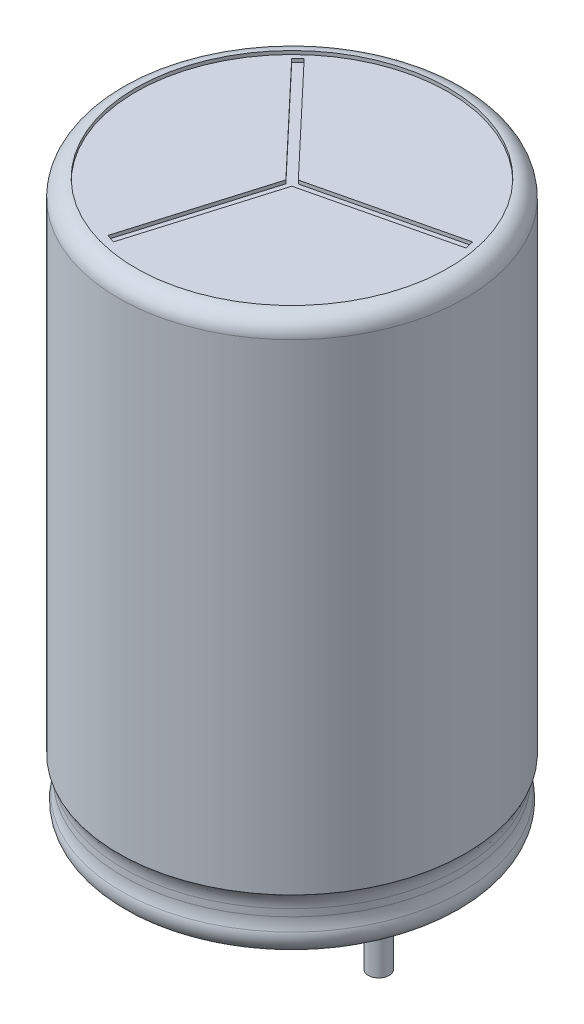
ISO-10303-21;
HEADER;
FILE_DESCRIPTION(('STEP AP214'),'2;1');
FILE_NAME('part.step','',(''),(''),'','','');
FILE_SCHEMA(('AUTOMOTIVE_DESIGN { 1 0 10303 214 1 1 1 1 }'));
ENDSEC;
DATA;
#1=APPLICATION_CONTEXT('core data for automotive mechanical design processes');
#2=APPLICATION_PROTOCOL_DEFINITION('international standard','automotive_design',2000,#1);
#3=PRODUCT_CONTEXT('',#1,'mechanical');
#4=PRODUCT('Part','Part','',(#3));
#5=PRODUCT_RELATED_PRODUCT_CATEGORY('part','',(#4));
#6=PRODUCT_DEFINITION_FORMATION('','',#4);
#7=PRODUCT_DEFINITION_CONTEXT('part definition',#1,'design');
#8=PRODUCT_DEFINITION('design','',#6,#7);
#9=PRODUCT_DEFINITION_SHAPE('','',#8);
#10=(LENGTH_UNIT() NAMED_UNIT(*) SI_UNIT(.MILLI.,.METRE.));
#11=(NAMED_UNIT(*) PLANE_ANGLE_UNIT() SI_UNIT($,.RADIAN.));
#12=(NAMED_UNIT(*) SI_UNIT($,.STERADIAN.) SOLID_ANGLE_UNIT());
#13=UNCERTAINTY_MEASURE_WITH_UNIT(LENGTH_MEASURE(1.E-05),#10,'distance_accuracy_value','');
#14=(GEOMETRIC_REPRESENTATION_CONTEXT(3) GLOBAL_UNCERTAINTY_ASSIGNED_CONTEXT((#13)) GLOBAL_UNIT_ASSIGNED_CONTEXT((#10,
#11,#12)) REPRESENTATION_CONTEXT('',''));
#15=CARTESIAN_POINT('',(0.,0.,0.));
#16=DIRECTION('',(0.,0.,1.));
#17=DIRECTION('',(1.,0.,0.));
#18=AXIS2_PLACEMENT_3D('',#15,#16,#17);
#19=CARTESIAN_POINT('',(0.,16.,0.));
#20=DIRECTION('',(0.,-1.,0.));
#21=DIRECTION('',(1.,0.,0.));
#22=AXIS2_PLACEMENT_3D('',#19,#20,#21);
#23=CYLINDRICAL_SURFACE('',#22,5.);
#24=CARTESIAN_POINT('',(0.,15.5,0.));
#25=DIRECTION('',(0.,1.,0.));
#26=DIRECTION('',(-1.,0.,0.));
#27=AXIS2_PLACEMENT_3D('',#24,#25,#26);
#28=CIRCLE('',#27,5.);
#29=CARTESIAN_POINT('',(-5.,15.5,0.));
#30=VERTEX_POINT('',#29);
#31=EDGE_CURVE('E196',#30,#30,#28,.F.);
#32=ORIENTED_EDGE('',*,*,#31,.T.);
#33=EDGE_LOOP('',(#32));
#34=FACE_BOUND('',#33,.T.);
#35=CARTESIAN_POINT('',(0.,1.64473841710325,0.));
#36=DIRECTION('',(0.,-1.,0.));
#37=DIRECTION('',(1.,0.,0.));
#38=AXIS2_PLACEMENT_3D('',#35,#36,#37);
#39=CIRCLE('',#38,5.);
#40=CARTESIAN_POINT('',(5.,1.64473841710325,0.));
#41=VERTEX_POINT('',#40);
#42=EDGE_CURVE('E179',#41,#41,#39,.T.);
#43=ORIENTED_EDGE('',*,*,#42,.F.);
#44=EDGE_LOOP('',(#43));
#45=FACE_BOUND('',#44,.T.);
#46=ADVANCED_FACE('F34',(#34,#45),#23,.T.);
#47=CARTESIAN_POINT('',(0.,0.,0.));
#48=DIRECTION('',(0.,-1.,0.));
#49=DIRECTION('',(1.,0.,0.));
#50=AXIS2_PLACEMENT_3D('',#47,#48,#49);
#51=PLANE('',#50);
#52=CARTESIAN_POINT('',(-2.5,0.,0.));
#53=DIRECTION('',(0.,-1.,0.));
#54=DIRECTION('',(1.,0.,0.));
#55=AXIS2_PLACEMENT_3D('',#52,#53,#54);
#56=CIRCLE('',#55,0.3);
#57=CARTESIAN_POINT('',(-2.2,0.,0.));
#58=VERTEX_POINT('',#57);
#59=EDGE_CURVE('E11',#58,#58,#56,.T.);
#60=ORIENTED_EDGE('',*,*,#59,.F.);
#61=EDGE_LOOP('',(#60));
#62=FACE_BOUND('',#61,.T.);
#63=CARTESIAN_POINT('',(0.,0.,0.));
#64=DIRECTION('',(0.,-1.,0.));
#65=DIRECTION('',(1.,0.,0.));
#66=AXIS2_PLACEMENT_3D('',#63,#64,#65);
#67=CIRCLE('',#66,4.44303636311794);
#68=CARTESIAN_POINT('',(4.44303636311794,0.,0.));
#69=VERTEX_POINT('',#68);
#70=EDGE_CURVE('E199',#69,#69,#67,.T.);
#71=ORIENTED_EDGE('',*,*,#70,.T.);
#72=EDGE_LOOP('',(#71));
#73=FACE_BOUND('',#72,.T.);
#74=CARTESIAN_POINT('',(2.5,0.,0.));
#75=DIRECTION('',(0.,-1.,0.));
#76=DIRECTION('',(1.,0.,0.));
#77=AXIS2_PLACEMENT_3D('',#74,#75,#76);
#78=CIRCLE('',#77,0.3);
#79=CARTESIAN_POINT('',(2.8,0.,0.));
#80=VERTEX_POINT('',#79);
#81=EDGE_CURVE('E193',#80,#80,#78,.T.);
#82=ORIENTED_EDGE('',*,*,#81,.F.);
#83=EDGE_LOOP('',(#82));
#84=FACE_BOUND('',#83,.T.);
#85=ADVANCED_FACE('F213',(#62,#73,#84),#51,.T.);
#86=CARTESIAN_POINT('',(0.,1.00008966030172,0.));
#87=DIRECTION('',(0.,-1.,0.));
#88=DIRECTION('',(1.,0.,0.));
#89=AXIS2_PLACEMENT_3D('',#86,#87,#88);
#90=TOROIDAL_SURFACE('',#89,5.93897047957049,1.07731054301534);
#91=CARTESIAN_POINT('',(0.,0.658526062770648,0.));
#92=DIRECTION('',(0.,1.,0.));
#93=DIRECTION('',(-1.,0.,0.));
#94=AXIS2_PLACEMENT_3D('',#91,#92,#93);
#95=CIRCLE('',#94,4.91724041985136);
#96=CARTESIAN_POINT('',(-4.91724041985136,0.658526062770648,0.));
#97=VERTEX_POINT('',#96);
#98=EDGE_CURVE('E42',#97,#97,#95,.T.);
#99=ORIENTED_EDGE('',*,*,#98,.T.);
#100=EDGE_LOOP('',(#99));
#101=FACE_BOUND('',#100,.T.);
#102=CARTESIAN_POINT('',(0.,1.00008966030172,0.));
#103=DIRECTION('',(0.,-1.,0.));
#104=DIRECTION('',(1.,0.,0.));
#105=AXIS2_PLACEMENT_3D('',#102,#103,#104);
#106=CIRCLE('',#105,4.86165993655515);
#107=CARTESIAN_POINT('',(4.86165993655515,1.00008966030172,0.));
#108=VERTEX_POINT('',#107);
#109=EDGE_CURVE('E190',#108,#108,#106,.T.);
#110=ORIENTED_EDGE('',*,*,#109,.T.);
#111=EDGE_LOOP('',(#110));
#112=FACE_BOUND('',#111,.T.);
#113=ADVANCED_FACE('F204',(#101,#112),#90,.F.);
#114=CARTESIAN_POINT('',(0.,16.,0.));
#115=DIRECTION('',(0.,-1.,0.));
#116=DIRECTION('',(1.,0.,0.));
#117=AXIS2_PLACEMENT_3D('',#114,#115,#116);
#118=CYLINDRICAL_SURFACE('',#117,4.86165993655515);
#119=CARTESIAN_POINT('',(0.,1.20291568549018,0.));
#120=DIRECTION('',(0.,-1.,0.));
#121=DIRECTION('',(1.,0.,0.));
#122=AXIS2_PLACEMENT_3D('',#119,#120,#121);
#123=CIRCLE('',#122,4.86165993655515);
#124=CARTESIAN_POINT('',(4.86165993655515,1.20291568549018,0.));
#125=VERTEX_POINT('',#124);
#126=EDGE_CURVE('E187',#125,#125,#123,.T.);
#127=ORIENTED_EDGE('',*,*,#126,.T.);
#128=EDGE_LOOP('',(#127));
#129=FACE_BOUND('',#128,.T.);
#130=ORIENTED_EDGE('',*,*,#109,.F.);
#131=EDGE_LOOP('',(#130));
#132=FACE_BOUND('',#131,.T.);
#133=ADVANCED_FACE('F270',(#129,#132),#118,.T.);
#134=CARTESIAN_POINT('',(0.,1.20291568549018,0.));
#135=DIRECTION('',(0.,-1.,0.));
#136=DIRECTION('',(1.,0.,0.));
#137=AXIS2_PLACEMENT_3D('',#134,#135,#136);
#138=TOROIDAL_SURFACE('',#137,5.62796972362068,0.766309787065526);
#139=CARTESIAN_POINT('',(0.,1.63995089907934,0.));
#140=DIRECTION('',(0.,-1.,0.));
#141=DIRECTION('',(1.,0.,0.));
#142=AXIS2_PLACEMENT_3D('',#139,#140,#141);
#143=CIRCLE('',#142,4.99850096995971);
#144=CARTESIAN_POINT('',(4.99850096995971,1.63995089907934,0.));
#145=VERTEX_POINT('',#144);
#146=EDGE_CURVE('E184',#145,#145,#143,.T.);
#147=ORIENTED_EDGE('',*,*,#146,.T.);
#148=EDGE_LOOP('',(#147));
#149=FACE_BOUND('',#148,.T.);
#150=ORIENTED_EDGE('',*,*,#126,.F.);
#151=EDGE_LOOP('',(#150));
#152=FACE_BOUND('',#151,.T.);
#153=ADVANCED_FACE('F262',(#149,#152),#138,.F.);
#154=CARTESIAN_POINT('',(0.,1.64473841710325,0.));
#155=DIRECTION('',(0.,-1.,0.));
#156=DIRECTION('',(1.,0.,0.));
#157=AXIS2_PLACEMENT_3D('',#154,#155,#156);
#158=TOROIDAL_SURFACE('',#157,4.99160543177437,0.00839456822563425);
#159=ORIENTED_EDGE('',*,*,#42,.T.);
#160=EDGE_LOOP('',(#159));
#161=FACE_BOUND('',#160,.T.);
#162=ORIENTED_EDGE('',*,*,#146,.F.);
#163=EDGE_LOOP('',(#162));
#164=FACE_BOUND('',#163,.T.);
#165=ADVANCED_FACE('F252',(#161,#164),#158,.T.);
#166=CARTESIAN_POINT('',(0.,15.9,0.));
#167=DIRECTION('',(0.,1.,0.));
#168=DIRECTION('',(0.,0.,1.));
#169=AXIS2_PLACEMENT_3D('',#166,#167,#168);
#170=CYLINDRICAL_SURFACE('',#169,4.5);
#171=CARTESIAN_POINT('',(0.,15.9,0.));
#172=DIRECTION('',(0.,1.,0.));
#173=DIRECTION('',(0.,0.,-1.));
#174=AXIS2_PLACEMENT_3D('',#171,#172,#173);
#175=CIRCLE('',#174,4.5);
#176=CARTESIAN_POINT('',(0.,15.9,-4.5));
#177=VERTEX_POINT('',#176);
#178=EDGE_CURVE('E176',#177,#177,#175,.T.);
#179=ORIENTED_EDGE('',*,*,#178,.F.);
#180=EDGE_LOOP('',(#179));
#181=FACE_BOUND('',#180,.T.);
#182=CARTESIAN_POINT('',(0.,16.,0.));
#183=DIRECTION('',(0.,1.,0.));
#184=DIRECTION('',(0.,0.,-1.));
#185=AXIS2_PLACEMENT_3D('',#182,#183,#184);
#186=CIRCLE('',#185,4.5);
#187=CARTESIAN_POINT('',(0.,16.,-4.5));
#188=VERTEX_POINT('',#187);
#189=EDGE_CURVE('E164',#188,#188,#186,.T.);
#190=ORIENTED_EDGE('',*,*,#189,.T.);
#191=EDGE_LOOP('',(#190));
#192=FACE_BOUND('',#191,.T.);
#193=ADVANCED_FACE('F249',(#181,#192),#170,.F.);
#194=CARTESIAN_POINT('',(0.,15.9,0.));
#195=DIRECTION('',(0.,-1.,0.));
#196=DIRECTION('',(0.,0.,-1.));
#197=AXIS2_PLACEMENT_3D('',#194,#195,#196);
#198=PLANE('',#197);
#199=DIRECTION('',(-0.726380713563257,0.,0.687292557040547));
#200=VECTOR('',#199,1.);
#201=CARTESIAN_POINT('',(-2.90603662225935,15.9,-3.25609368585913));
#202=LINE('',#201,#200);
#203=CARTESIAN_POINT('',(-2.90603662225935,15.9,-3.25609368585913));
#204=VERTEX_POINT('',#203);
#205=CARTESIAN_POINT('',(-3.09053732350442,15.9,-3.08152137637083));
#206=VERTEX_POINT('',#205);
#207=EDGE_CURVE('E141',#204,#206,#202,.T.);
#208=ORIENTED_EDGE('',*,*,#207,.F.);
#209=DIRECTION('',(-0.687292557040547,0.,-0.726380713563257));
#210=VECTOR('',#209,1.);
#211=CARTESIAN_POINT('',(0.0418556656844751,15.9,-0.140546919508894));
#212=LINE('',#211,#210);
#213=CARTESIAN_POINT('',(0.0418556656844751,15.9,-0.140546919508894));
#214=VERTEX_POINT('',#213);
#215=EDGE_CURVE('E49',#214,#204,#212,.T.);
#216=ORIENTED_EDGE('',*,*,#215,.F.);
#217=DIRECTION('',(-0.972710429285123,0.,0.232022457447447));
#218=VECTOR('',#217,1.);
#219=CARTESIAN_POINT('',(4.09665425880726,15.9,-1.10774569286042));
#220=LINE('',#219,#218);
#221=CARTESIAN_POINT('',(4.09665425880726,15.9,-1.10774569286042));
#222=VERTEX_POINT('',#221);
#223=EDGE_CURVE('E160',#222,#214,#220,.T.);
#224=ORIENTED_EDGE('',*,*,#223,.F.);
#225=DIRECTION('',(-0.232022457447447,0.,-0.972710429285123));
#226=VECTOR('',#225,1.);
#227=CARTESIAN_POINT('',(4.15558796299891,15.9,-0.860677243821993));
#228=LINE('',#227,#226);
#229=CARTESIAN_POINT('',(4.15558796299891,15.9,-0.860677243821993));
#230=VERTEX_POINT('',#229);
#231=EDGE_CURVE('E158',#230,#222,#228,.T.);
#232=ORIENTED_EDGE('',*,*,#231,.F.);
#233=DIRECTION('',(0.972710429285123,0.,-0.232022457447447));
#234=VECTOR('',#233,1.);
#235=CARTESIAN_POINT('',(0.100789369876127,15.9,0.106521529529527));
#236=LINE('',#235,#234);
#237=CARTESIAN_POINT('',(0.100789369876127,15.9,0.106521529529527));
#238=VERTEX_POINT('',#237);
#239=EDGE_CURVE('E115',#238,#230,#236,.T.);
#240=ORIENTED_EDGE('',*,*,#239,.F.);
#241=DIRECTION('',(0.285417872244571,0.,-0.958403171010709));
#242=VECTOR('',#241,1.);
#243=CARTESIAN_POINT('',(-1.07721556960452,15.9,4.06213811578557));
#244=LINE('',#243,#242);
#245=CARTESIAN_POINT('',(-1.07721556960452,15.9,4.06213811578557));
#246=VERTEX_POINT('',#245);
#247=EDGE_CURVE('E154',#246,#238,#244,.T.);
#248=ORIENTED_EDGE('',*,*,#247,.F.);
#249=DIRECTION('',(0.958403171010708,0.,0.285417872244572));
#250=VECTOR('',#249,1.);
#251=CARTESIAN_POINT('',(-1.32064997504124,15.9,3.98964197623545));
#252=LINE('',#251,#250);
#253=CARTESIAN_POINT('',(-1.32064997504124,15.9,3.98964197623545));
#254=VERTEX_POINT('',#253);
#255=EDGE_CURVE('E151',#254,#246,#252,.T.);
#256=ORIENTED_EDGE('',*,*,#255,.F.);
#257=DIRECTION('',(-0.285417872244571,0.,0.958403171010709));
#258=VECTOR('',#257,1.);
#259=CARTESIAN_POINT('',(-0.142645035560593,15.9,0.0340253899794046));
#260=LINE('',#259,#258);
#261=CARTESIAN_POINT('',(-0.142645035560593,15.9,0.0340253899794046));
#262=VERTEX_POINT('',#261);
#263=EDGE_CURVE('E148',#262,#254,#260,.T.);
#264=ORIENTED_EDGE('',*,*,#263,.F.);
#265=DIRECTION('',(0.687292557040547,0.,0.726380713563257));
#266=VECTOR('',#265,1.);
#267=CARTESIAN_POINT('',(-3.09053732350442,15.9,-3.08152137637083));
#268=LINE('',#267,#266);
#269=EDGE_CURVE('E145',#206,#262,#268,.T.);
#270=ORIENTED_EDGE('',*,*,#269,.F.);
#271=EDGE_LOOP('',(#208,#216,#224,#232,#240,#248,#256,#264,#270));
#272=FACE_BOUND('',#271,.T.);
#273=ORIENTED_EDGE('',*,*,#178,.T.);
#274=EDGE_LOOP('',(#273));
#275=FACE_BOUND('',#274,.T.);
#276=ADVANCED_FACE('F251',(#272,#275),#198,.F.);
#277=CARTESIAN_POINT('',(0.0418556656844751,15.8,-0.140546919508894));
#278=DIRECTION('',(0.726380713563257,0.,-0.687292557040547));
#279=DIRECTION('',(-0.687292557040547,0.,-0.726380713563257));
#280=AXIS2_PLACEMENT_3D('',#277,#278,#279);
#281=PLANE('',#280);
#282=ORIENTED_EDGE('',*,*,#215,.T.);
#283=DIRECTION('',(0.,1.,0.));
#284=VECTOR('',#283,1.);
#285=CARTESIAN_POINT('',(-2.90603662225935,15.8,-3.25609368585913));
#286=LINE('',#285,#284);
#287=CARTESIAN_POINT('',(-2.90603662225935,15.8,-3.25609368585913));
#288=VERTEX_POINT('',#287);
#289=EDGE_CURVE('E88',#288,#204,#286,.T.);
#290=ORIENTED_EDGE('',*,*,#289,.F.);
#291=DIRECTION('',(-0.687292557040547,0.,-0.726380713563257));
#292=VECTOR('',#291,1.);
#293=CARTESIAN_POINT('',(0.0418556656844751,15.8,-0.140546919508894));
#294=LINE('',#293,#292);
#295=CARTESIAN_POINT('',(0.0418556656844751,15.8,-0.140546919508894));
#296=VERTEX_POINT('',#295);
#297=EDGE_CURVE('E162',#296,#288,#294,.T.);
#298=ORIENTED_EDGE('',*,*,#297,.F.);
#299=DIRECTION('',(0.,1.,0.));
#300=VECTOR('',#299,1.);
#301=CARTESIAN_POINT('',(0.0418556656844751,15.8,-0.140546919508894));
#302=LINE('',#301,#300);
#303=EDGE_CURVE('E57',#296,#214,#302,.T.);
#304=ORIENTED_EDGE('',*,*,#303,.T.);
#305=EDGE_LOOP('',(#282,#290,#298,#304));
#306=FACE_BOUND('',#305,.T.);
#307=ADVANCED_FACE('F259',(#306),#281,.F.);
#308=CARTESIAN_POINT('',(4.09665425880726,15.8,-1.10774569286042));
#309=DIRECTION('',(-0.232022457447447,0.,-0.972710429285123));
#310=DIRECTION('',(-0.972710429285123,0.,0.232022457447447));
#311=AXIS2_PLACEMENT_3D('',#308,#309,#310);
#312=PLANE('',#311);
#313=ORIENTED_EDGE('',*,*,#223,.T.);
#314=ORIENTED_EDGE('',*,*,#303,.F.);
#315=DIRECTION('',(-0.972710429285123,0.,0.232022457447447));
#316=VECTOR('',#315,1.);
#317=CARTESIAN_POINT('',(4.09665425880726,15.8,-1.10774569286042));
#318=LINE('',#317,#316);
#319=CARTESIAN_POINT('',(4.09665425880726,15.8,-1.10774569286042));
#320=VERTEX_POINT('',#319);
#321=EDGE_CURVE('E127',#320,#296,#318,.T.);
#322=ORIENTED_EDGE('',*,*,#321,.F.);
#323=DIRECTION('',(0.,1.,0.));
#324=VECTOR('',#323,1.);
#325=CARTESIAN_POINT('',(4.09665425880726,15.8,-1.10774569286042));
#326=LINE('',#325,#324);
#327=EDGE_CURVE('E119',#320,#222,#326,.T.);
#328=ORIENTED_EDGE('',*,*,#327,.T.);
#329=EDGE_LOOP('',(#313,#314,#322,#328));
#330=FACE_BOUND('',#329,.T.);
#331=ADVANCED_FACE('F310',(#330),#312,.F.);
#332=CARTESIAN_POINT('',(4.15558796299891,15.8,-0.860677243821993));
#333=DIRECTION('',(0.972710429285123,0.,-0.232022457447447));
#334=DIRECTION('',(-0.232022457447447,0.,-0.972710429285123));
#335=AXIS2_PLACEMENT_3D('',#332,#333,#334);
#336=PLANE('',#335);
#337=ORIENTED_EDGE('',*,*,#231,.T.);
#338=ORIENTED_EDGE('',*,*,#327,.F.);
#339=DIRECTION('',(-0.232022457447447,0.,-0.972710429285123));
#340=VECTOR('',#339,1.);
#341=CARTESIAN_POINT('',(4.15558796299891,15.8,-0.860677243821993));
#342=LINE('',#341,#340);
#343=CARTESIAN_POINT('',(4.15558796299891,15.8,-0.860677243821993));
#344=VERTEX_POINT('',#343);
#345=EDGE_CURVE('E123',#344,#320,#342,.T.);
#346=ORIENTED_EDGE('',*,*,#345,.F.);
#347=DIRECTION('',(0.,1.,0.));
#348=VECTOR('',#347,1.);
#349=CARTESIAN_POINT('',(4.15558796299891,15.8,-0.860677243821993));
#350=LINE('',#349,#348);
#351=EDGE_CURVE('E108',#344,#230,#350,.T.);
#352=ORIENTED_EDGE('',*,*,#351,.T.);
#353=EDGE_LOOP('',(#337,#338,#346,#352));
#354=FACE_BOUND('',#353,.T.);
#355=ADVANCED_FACE('F124',(#354),#336,.F.);
#356=CARTESIAN_POINT('',(0.100789369876127,15.8,0.106521529529527));
#357=DIRECTION('',(0.232022457447447,0.,0.972710429285123));
#358=DIRECTION('',(0.972710429285123,0.,-0.232022457447447));
#359=AXIS2_PLACEMENT_3D('',#356,#357,#358);
#360=PLANE('',#359);
#361=ORIENTED_EDGE('',*,*,#239,.T.);
#362=ORIENTED_EDGE('',*,*,#351,.F.);
#363=DIRECTION('',(0.972710429285123,0.,-0.232022457447447));
#364=VECTOR('',#363,1.);
#365=CARTESIAN_POINT('',(0.100789369876127,15.8,0.106521529529527));
#366=LINE('',#365,#364);
#367=CARTESIAN_POINT('',(0.100789369876127,15.8,0.106521529529527));
#368=VERTEX_POINT('',#367);
#369=EDGE_CURVE('E112',#368,#344,#366,.T.);
#370=ORIENTED_EDGE('',*,*,#369,.F.);
#371=DIRECTION('',(0.,1.,0.));
#372=VECTOR('',#371,1.);
#373=CARTESIAN_POINT('',(0.100789369876127,15.8,0.106521529529527));
#374=LINE('',#373,#372);
#375=EDGE_CURVE('E120',#368,#238,#374,.T.);
#376=ORIENTED_EDGE('',*,*,#375,.T.);
#377=EDGE_LOOP('',(#361,#362,#370,#376));
#378=FACE_BOUND('',#377,.T.);
#379=ADVANCED_FACE('F110',(#378),#360,.F.);
#380=CARTESIAN_POINT('',(-1.07721556960452,15.8,4.06213811578557));
#381=DIRECTION('',(0.958403171010709,0.,0.285417872244571));
#382=DIRECTION('',(0.285417872244571,0.,-0.958403171010709));
#383=AXIS2_PLACEMENT_3D('',#380,#381,#382);
#384=PLANE('',#383);
#385=ORIENTED_EDGE('',*,*,#247,.T.);
#386=ORIENTED_EDGE('',*,*,#375,.F.);
#387=DIRECTION('',(0.285417872244571,0.,-0.958403171010709));
#388=VECTOR('',#387,1.);
#389=CARTESIAN_POINT('',(-1.07721556960452,15.8,4.06213811578557));
#390=LINE('',#389,#388);
#391=CARTESIAN_POINT('',(-1.07721556960452,15.8,4.06213811578557));
#392=VERTEX_POINT('',#391);
#393=EDGE_CURVE('E133',#392,#368,#390,.T.);
#394=ORIENTED_EDGE('',*,*,#393,.F.);
#395=DIRECTION('',(0.,1.,0.));
#396=VECTOR('',#395,1.);
#397=CARTESIAN_POINT('',(-1.07721556960452,15.8,4.06213811578557));
#398=LINE('',#397,#396);
#399=EDGE_CURVE('E167',#392,#246,#398,.T.);
#400=ORIENTED_EDGE('',*,*,#399,.T.);
#401=EDGE_LOOP('',(#385,#386,#394,#400));
#402=FACE_BOUND('',#401,.T.);
#403=ADVANCED_FACE('F334',(#402),#384,.F.);
#404=CARTESIAN_POINT('',(-1.32064997504124,15.8,3.98964197623545));
#405=DIRECTION('',(-0.285417872244572,0.,0.958403171010708));
#406=DIRECTION('',(0.958403171010708,0.,0.285417872244572));
#407=AXIS2_PLACEMENT_3D('',#404,#405,#406);
#408=PLANE('',#407);
#409=ORIENTED_EDGE('',*,*,#255,.T.);
#410=ORIENTED_EDGE('',*,*,#399,.F.);
#411=DIRECTION('',(0.958403171010708,0.,0.285417872244572));
#412=VECTOR('',#411,1.);
#413=CARTESIAN_POINT('',(-1.32064997504124,15.8,3.98964197623545));
#414=LINE('',#413,#412);
#415=CARTESIAN_POINT('',(-1.32064997504124,15.8,3.98964197623545));
#416=VERTEX_POINT('',#415);
#417=EDGE_CURVE('E135',#416,#392,#414,.T.);
#418=ORIENTED_EDGE('',*,*,#417,.F.);
#419=DIRECTION('',(0.,1.,0.));
#420=VECTOR('',#419,1.);
#421=CARTESIAN_POINT('',(-1.32064997504124,15.8,3.98964197623545));
#422=LINE('',#421,#420);
#423=EDGE_CURVE('E169',#416,#254,#422,.T.);
#424=ORIENTED_EDGE('',*,*,#423,.T.);
#425=EDGE_LOOP('',(#409,#410,#418,#424));
#426=FACE_BOUND('',#425,.T.);
#427=ADVANCED_FACE('F343',(#426),#408,.F.);
#428=CARTESIAN_POINT('',(-0.142645035560593,15.8,0.0340253899794046));
#429=DIRECTION('',(-0.958403171010709,0.,-0.285417872244571));
#430=DIRECTION('',(-0.285417872244571,0.,0.958403171010709));
#431=AXIS2_PLACEMENT_3D('',#428,#429,#430);
#432=PLANE('',#431);
#433=ORIENTED_EDGE('',*,*,#263,.T.);
#434=ORIENTED_EDGE('',*,*,#423,.F.);
#435=DIRECTION('',(-0.285417872244571,0.,0.958403171010709));
#436=VECTOR('',#435,1.);
#437=CARTESIAN_POINT('',(-0.142645035560593,15.8,0.0340253899794046));
#438=LINE('',#437,#436);
#439=CARTESIAN_POINT('',(-0.142645035560593,15.8,0.0340253899794046));
#440=VERTEX_POINT('',#439);
#441=EDGE_CURVE('E463',#440,#416,#438,.T.);
#442=ORIENTED_EDGE('',*,*,#441,.F.);
#443=DIRECTION('',(0.,1.,0.));
#444=VECTOR('',#443,1.);
#445=CARTESIAN_POINT('',(-0.142645035560593,15.8,0.0340253899794046));
#446=LINE('',#445,#444);
#447=EDGE_CURVE('E171',#440,#262,#446,.T.);
#448=ORIENTED_EDGE('',*,*,#447,.T.);
#449=EDGE_LOOP('',(#433,#434,#442,#448));
#450=FACE_BOUND('',#449,.T.);
#451=ADVANCED_FACE('F353',(#450),#432,.F.);
#452=CARTESIAN_POINT('',(-3.09053732350442,15.8,-3.08152137637083));
#453=DIRECTION('',(-0.726380713563257,0.,0.687292557040547));
#454=DIRECTION('',(0.687292557040547,0.,0.726380713563257));
#455=AXIS2_PLACEMENT_3D('',#452,#453,#454);
#456=PLANE('',#455);
#457=ORIENTED_EDGE('',*,*,#269,.T.);
#458=ORIENTED_EDGE('',*,*,#447,.F.);
#459=DIRECTION('',(0.687292557040547,0.,0.726380713563257));
#460=VECTOR('',#459,1.);
#461=CARTESIAN_POINT('',(-3.09053732350442,15.8,-3.08152137637083));
#462=LINE('',#461,#460);
#463=CARTESIAN_POINT('',(-3.09053732350442,15.8,-3.08152137637083));
#464=VERTEX_POINT('',#463);
#465=EDGE_CURVE('E460',#464,#440,#462,.T.);
#466=ORIENTED_EDGE('',*,*,#465,.F.);
#467=DIRECTION('',(0.,1.,0.));
#468=VECTOR('',#467,1.);
#469=CARTESIAN_POINT('',(-3.09053732350442,15.8,-3.08152137637083));
#470=LINE('',#469,#468);
#471=EDGE_CURVE('E173',#464,#206,#470,.T.);
#472=ORIENTED_EDGE('',*,*,#471,.T.);
#473=EDGE_LOOP('',(#457,#458,#466,#472));
#474=FACE_BOUND('',#473,.T.);
#475=ADVANCED_FACE('F363',(#474),#456,.F.);
#476=CARTESIAN_POINT('',(-2.90603662225935,15.8,-3.25609368585913));
#477=DIRECTION('',(-0.687292557040547,0.,-0.726380713563257));
#478=DIRECTION('',(-0.726380713563257,0.,0.687292557040547));
#479=AXIS2_PLACEMENT_3D('',#476,#477,#478);
#480=PLANE('',#479);
#481=ORIENTED_EDGE('',*,*,#207,.T.);
#482=ORIENTED_EDGE('',*,*,#471,.F.);
#483=DIRECTION('',(-0.726380713563257,0.,0.687292557040547));
#484=VECTOR('',#483,1.);
#485=CARTESIAN_POINT('',(-2.90603662225935,15.8,-3.25609368585913));
#486=LINE('',#485,#484);
#487=EDGE_CURVE('E457',#288,#464,#486,.T.);
#488=ORIENTED_EDGE('',*,*,#487,.F.);
#489=ORIENTED_EDGE('',*,*,#289,.T.);
#490=EDGE_LOOP('',(#481,#482,#488,#489));
#491=FACE_BOUND('',#490,.T.);
#492=ADVANCED_FACE('F231',(#491),#480,.F.);
#493=CARTESIAN_POINT('',(0.,15.8,0.));
#494=DIRECTION('',(0.,1.,0.));
#495=DIRECTION('',(0.,0.,1.));
#496=AXIS2_PLACEMENT_3D('',#493,#494,#495);
#497=PLANE('',#496);
#498=ORIENTED_EDGE('',*,*,#297,.T.);
#499=ORIENTED_EDGE('',*,*,#487,.T.);
#500=ORIENTED_EDGE('',*,*,#465,.T.);
#501=ORIENTED_EDGE('',*,*,#441,.T.);
#502=ORIENTED_EDGE('',*,*,#417,.T.);
#503=ORIENTED_EDGE('',*,*,#393,.T.);
#504=ORIENTED_EDGE('',*,*,#369,.T.);
#505=ORIENTED_EDGE('',*,*,#345,.T.);
#506=ORIENTED_EDGE('',*,*,#321,.T.);
#507=EDGE_LOOP('',(#498,#499,#500,#501,#502,#503,#504,#505,#506));
#508=FACE_BOUND('',#507,.T.);
#509=ADVANCED_FACE('F130',(#508),#497,.T.);
#510=CARTESIAN_POINT('',(2.5,-2.5,0.));
#511=DIRECTION('',(0.,1.,0.));
#512=DIRECTION('',(0.,0.,1.));
#513=AXIS2_PLACEMENT_3D('',#510,#511,#512);
#514=CYLINDRICAL_SURFACE('',#513,0.3);
#515=CARTESIAN_POINT('',(2.5,-2.5,0.));
#516=DIRECTION('',(0.,1.,0.));
#517=DIRECTION('',(0.,0.,1.));
#518=AXIS2_PLACEMENT_3D('',#515,#516,#517);
#519=CIRCLE('',#518,0.3);
#520=CARTESIAN_POINT('',(2.5,-2.5,0.3));
#521=VERTEX_POINT('',#520);
#522=EDGE_CURVE('E142',#521,#521,#519,.T.);
#523=ORIENTED_EDGE('',*,*,#522,.T.);
#524=EDGE_LOOP('',(#523));
#525=FACE_BOUND('',#524,.T.);
#526=ORIENTED_EDGE('',*,*,#81,.T.);
#527=EDGE_LOOP('',(#526));
#528=FACE_BOUND('',#527,.T.);
#529=ADVANCED_FACE('F220',(#525,#528),#514,.T.);
#530=CARTESIAN_POINT('',(2.8,-2.5,0.));
#531=DIRECTION('',(0.,-1.,0.));
#532=DIRECTION('',(0.,0.,-1.));
#533=AXIS2_PLACEMENT_3D('',#530,#531,#532);
#534=PLANE('',#533);
#535=ORIENTED_EDGE('',*,*,#522,.F.);
#536=EDGE_LOOP('',(#535));
#537=FACE_BOUND('',#536,.T.);
#538=ADVANCED_FACE('F222',(#537),#534,.T.);
#539=CARTESIAN_POINT('',(0.,15.5,0.));
#540=DIRECTION('',(0.,1.,0.));
#541=DIRECTION('',(-1.,0.,0.));
#542=AXIS2_PLACEMENT_3D('',#539,#540,#541);
#543=TOROIDAL_SURFACE('',#542,4.5,0.5);
#544=ORIENTED_EDGE('',*,*,#189,.F.);
#545=EDGE_LOOP('',(#544));
#546=FACE_BOUND('',#545,.T.);
#547=ORIENTED_EDGE('',*,*,#31,.F.);
#548=EDGE_LOOP('',(#547));
#549=FACE_BOUND('',#548,.T.);
#550=ADVANCED_FACE('F210',(#546,#549),#543,.T.);
#551=CARTESIAN_POINT('',(0.,0.5,0.));
#552=DIRECTION('',(0.,1.,0.));
#553=DIRECTION('',(-1.,0.,0.));
#554=AXIS2_PLACEMENT_3D('',#551,#552,#553);
#555=TOROIDAL_SURFACE('',#554,4.44303636311794,0.5);
#556=ORIENTED_EDGE('',*,*,#98,.F.);
#557=EDGE_LOOP('',(#556));
#558=FACE_BOUND('',#557,.T.);
#559=ORIENTED_EDGE('',*,*,#70,.F.);
#560=EDGE_LOOP('',(#559));
#561=FACE_BOUND('',#560,.T.);
#562=ADVANCED_FACE('F36',(#558,#561),#555,.T.);
#563=CARTESIAN_POINT('',(-2.5,-2.5,0.));
#564=DIRECTION('',(0.,1.,0.));
#565=DIRECTION('',(0.,0.,1.));
#566=AXIS2_PLACEMENT_3D('',#563,#564,#565);
#567=CYLINDRICAL_SURFACE('',#566,0.3);
#568=CARTESIAN_POINT('',(-2.5,-2.5,0.));
#569=DIRECTION('',(0.,-1.,0.));
#570=DIRECTION('',(0.,0.,1.));
#571=AXIS2_PLACEMENT_3D('',#568,#569,#570);
#572=CIRCLE('',#571,0.3);
#573=CARTESIAN_POINT('',(-2.5,-2.5,0.3));
#574=VERTEX_POINT('',#573);
#575=EDGE_CURVE('E452',#574,#574,#572,.T.);
#576=ORIENTED_EDGE('',*,*,#575,.F.);
#577=EDGE_LOOP('',(#576));
#578=FACE_BOUND('',#577,.T.);
#579=ORIENTED_EDGE('',*,*,#59,.T.);
#580=EDGE_LOOP('',(#579));
#581=FACE_BOUND('',#580,.T.);
#582=ADVANCED_FACE('F209',(#578,#581),#567,.T.);
#583=CARTESIAN_POINT('',(-2.8,-2.5,0.));
#584=DIRECTION('',(0.,-1.,0.));
#585=DIRECTION('',(0.,0.,-1.));
#586=AXIS2_PLACEMENT_3D('',#583,#584,#585);
#587=PLANE('',#586);
#588=ORIENTED_EDGE('',*,*,#575,.T.);
#589=EDGE_LOOP('',(#588));
#590=FACE_BOUND('',#589,.T.);
#591=ADVANCED_FACE('F433',(#590),#587,.T.);
#592=CLOSED_SHELL('',(#46,#85,#113,#133,#153,#165,#193,#276,#307,#331,#355,#379,#403,#427,#451,
#475,#492,#509,#529,#538,#550,#562,#582,#591));
#593=MANIFOLD_SOLID_BREP('B2',#592);
#594=ADVANCED_BREP_SHAPE_REPRESENTATION('',(#18,#593),#14);
#595=SHAPE_DEFINITION_REPRESENTATION(#9,#594);
ENDSEC;
END-ISO-10303-21;
